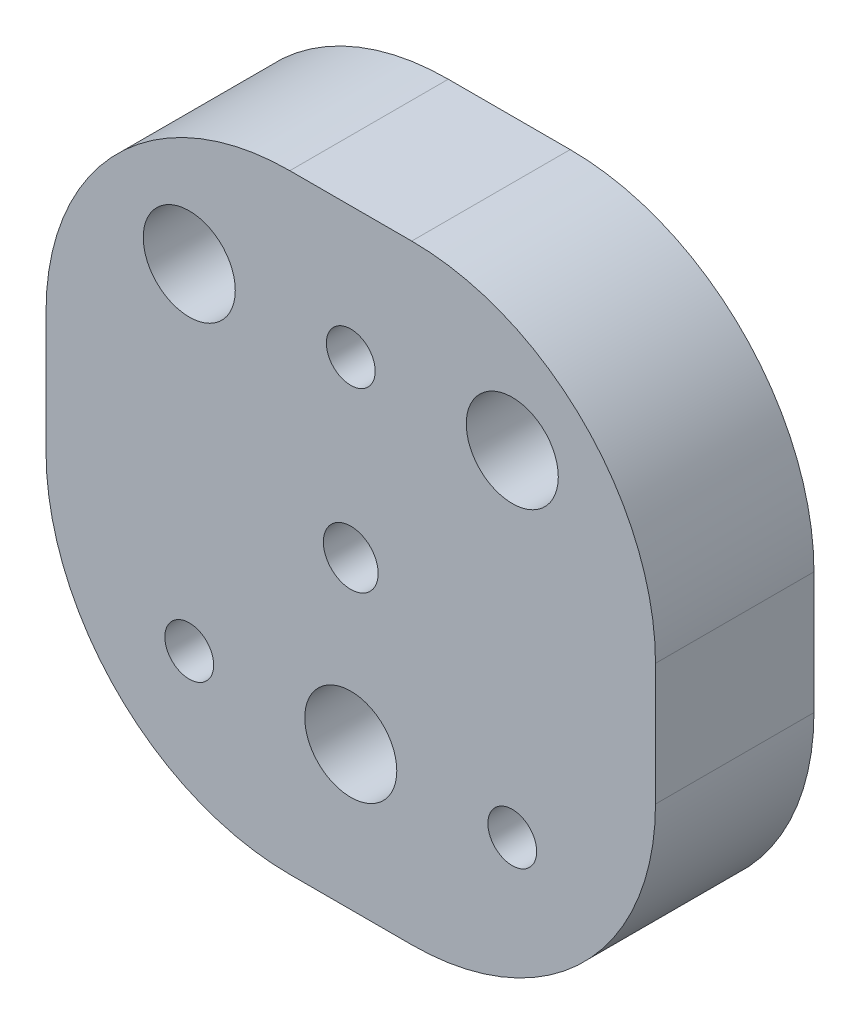
ISO-10303-21;
HEADER;
FILE_DESCRIPTION(('STEP AP214'),'2;1');
FILE_NAME('part.step','',(''),(''),'','','');
FILE_SCHEMA(('AUTOMOTIVE_DESIGN { 1 0 10303 214 1 1 1 1 }'));
ENDSEC;
DATA;
#1=APPLICATION_CONTEXT('core data for automotive mechanical design processes');
#2=APPLICATION_PROTOCOL_DEFINITION('international standard','automotive_design',2000,#1);
#3=PRODUCT_CONTEXT('',#1,'mechanical');
#4=PRODUCT('Part','Part','',(#3));
#5=PRODUCT_RELATED_PRODUCT_CATEGORY('part','',(#4));
#6=PRODUCT_DEFINITION_FORMATION('','',#4);
#7=PRODUCT_DEFINITION_CONTEXT('part definition',#1,'design');
#8=PRODUCT_DEFINITION('design','',#6,#7);
#9=PRODUCT_DEFINITION_SHAPE('','',#8);
#10=(LENGTH_UNIT() NAMED_UNIT(*) SI_UNIT(.MILLI.,.METRE.));
#11=(NAMED_UNIT(*) PLANE_ANGLE_UNIT() SI_UNIT($,.RADIAN.));
#12=(NAMED_UNIT(*) SI_UNIT($,.STERADIAN.) SOLID_ANGLE_UNIT());
#13=UNCERTAINTY_MEASURE_WITH_UNIT(LENGTH_MEASURE(1.E-05),#10,'distance_accuracy_value','');
#14=(GEOMETRIC_REPRESENTATION_CONTEXT(3) GLOBAL_UNCERTAINTY_ASSIGNED_CONTEXT((#13)) GLOBAL_UNIT_ASSIGNED_CONTEXT((#10,
#11,#12)) REPRESENTATION_CONTEXT('',''));
#15=CARTESIAN_POINT('',(0.,0.,0.));
#16=DIRECTION('',(0.,0.,1.));
#17=DIRECTION('',(1.,0.,0.));
#18=AXIS2_PLACEMENT_3D('',#15,#16,#17);
#19=CARTESIAN_POINT('',(50.,-50.,26.));
#20=DIRECTION('',(-1.,0.,0.));
#21=DIRECTION('',(0.,0.,1.));
#22=AXIS2_PLACEMENT_3D('',#19,#20,#21);
#23=PLANE('',#22);
#24=DIRECTION('',(0.,1.,0.));
#25=VECTOR('',#24,1.);
#26=CARTESIAN_POINT('',(50.,-50.,0.));
#27=LINE('',#26,#25);
#28=CARTESIAN_POINT('',(50.,-10.,0.));
#29=VERTEX_POINT('',#28);
#30=CARTESIAN_POINT('',(50.,10.,0.));
#31=VERTEX_POINT('',#30);
#32=EDGE_CURVE('E128',#29,#31,#27,.T.);
#33=ORIENTED_EDGE('',*,*,#32,.T.);
#34=DIRECTION('',(0.,0.,-1.));
#35=VECTOR('',#34,1.);
#36=CARTESIAN_POINT('',(50.,10.,26.));
#37=LINE('',#36,#35);
#38=CARTESIAN_POINT('',(50.,10.,26.));
#39=VERTEX_POINT('',#38);
#40=EDGE_CURVE('E106',#31,#39,#37,.F.);
#41=ORIENTED_EDGE('',*,*,#40,.T.);
#42=DIRECTION('',(0.,1.,0.));
#43=VECTOR('',#42,1.);
#44=CARTESIAN_POINT('',(50.,-50.,26.));
#45=LINE('',#44,#43);
#46=CARTESIAN_POINT('',(50.,-10.,26.));
#47=VERTEX_POINT('',#46);
#48=EDGE_CURVE('E138',#47,#39,#45,.T.);
#49=ORIENTED_EDGE('',*,*,#48,.F.);
#50=DIRECTION('',(0.,0.,-1.));
#51=VECTOR('',#50,1.);
#52=CARTESIAN_POINT('',(50.,-10.,26.));
#53=LINE('',#52,#51);
#54=EDGE_CURVE('E111',#47,#29,#53,.T.);
#55=ORIENTED_EDGE('',*,*,#54,.T.);
#56=EDGE_LOOP('',(#33,#41,#49,#55));
#57=FACE_BOUND('',#56,.T.);
#58=ADVANCED_FACE('F35',(#57),#23,.F.);
#59=CARTESIAN_POINT('',(-50.,50.,26.));
#60=DIRECTION('',(0.,-1.,0.));
#61=DIRECTION('',(0.,0.,-1.));
#62=AXIS2_PLACEMENT_3D('',#59,#60,#61);
#63=PLANE('',#62);
#64=DIRECTION('',(-1.,0.,0.));
#65=VECTOR('',#64,1.);
#66=CARTESIAN_POINT('',(-50.,50.,26.));
#67=LINE('',#66,#65);
#68=CARTESIAN_POINT('',(10.,50.,26.));
#69=VERTEX_POINT('',#68);
#70=CARTESIAN_POINT('',(-10.,50.,26.));
#71=VERTEX_POINT('',#70);
#72=EDGE_CURVE('E121',#69,#71,#67,.T.);
#73=ORIENTED_EDGE('',*,*,#72,.F.);
#74=DIRECTION('',(0.,0.,-1.));
#75=VECTOR('',#74,1.);
#76=CARTESIAN_POINT('',(10.,50.,26.));
#77=LINE('',#76,#75);
#78=CARTESIAN_POINT('',(10.,50.,0.));
#79=VERTEX_POINT('',#78);
#80=EDGE_CURVE('E105',#69,#79,#77,.T.);
#81=ORIENTED_EDGE('',*,*,#80,.T.);
#82=DIRECTION('',(-1.,0.,0.));
#83=VECTOR('',#82,1.);
#84=CARTESIAN_POINT('',(-50.,50.,0.));
#85=LINE('',#84,#83);
#86=CARTESIAN_POINT('',(-10.,50.,0.));
#87=VERTEX_POINT('',#86);
#88=EDGE_CURVE('E118',#79,#87,#85,.T.);
#89=ORIENTED_EDGE('',*,*,#88,.T.);
#90=DIRECTION('',(0.,0.,-1.));
#91=VECTOR('',#90,1.);
#92=CARTESIAN_POINT('',(-10.,50.,26.));
#93=LINE('',#92,#91);
#94=EDGE_CURVE('E123',#87,#71,#93,.F.);
#95=ORIENTED_EDGE('',*,*,#94,.T.);
#96=EDGE_LOOP('',(#73,#81,#89,#95));
#97=FACE_BOUND('',#96,.T.);
#98=ADVANCED_FACE('F117',(#97),#63,.F.);
#99=CARTESIAN_POINT('',(-50.,-50.,26.));
#100=DIRECTION('',(1.,0.,0.));
#101=DIRECTION('',(0.,0.,-1.));
#102=AXIS2_PLACEMENT_3D('',#99,#100,#101);
#103=PLANE('',#102);
#104=DIRECTION('',(0.,-1.,0.));
#105=VECTOR('',#104,1.);
#106=CARTESIAN_POINT('',(-50.,-50.,26.));
#107=LINE('',#106,#105);
#108=CARTESIAN_POINT('',(-50.,10.,26.));
#109=VERTEX_POINT('',#108);
#110=CARTESIAN_POINT('',(-50.,-10.,26.));
#111=VERTEX_POINT('',#110);
#112=EDGE_CURVE('E175',#109,#111,#107,.T.);
#113=ORIENTED_EDGE('',*,*,#112,.F.);
#114=DIRECTION('',(0.,0.,-1.));
#115=VECTOR('',#114,1.);
#116=CARTESIAN_POINT('',(-50.,10.,26.));
#117=LINE('',#116,#115);
#118=CARTESIAN_POINT('',(-50.,10.,0.));
#119=VERTEX_POINT('',#118);
#120=EDGE_CURVE('E168',#109,#119,#117,.T.);
#121=ORIENTED_EDGE('',*,*,#120,.T.);
#122=DIRECTION('',(0.,-1.,0.));
#123=VECTOR('',#122,1.);
#124=CARTESIAN_POINT('',(-50.,-50.,0.));
#125=LINE('',#124,#123);
#126=CARTESIAN_POINT('',(-50.,-10.,0.));
#127=VERTEX_POINT('',#126);
#128=EDGE_CURVE('E127',#119,#127,#125,.T.);
#129=ORIENTED_EDGE('',*,*,#128,.T.);
#130=DIRECTION('',(0.,0.,-1.));
#131=VECTOR('',#130,1.);
#132=CARTESIAN_POINT('',(-50.,-10.,26.));
#133=LINE('',#132,#131);
#134=EDGE_CURVE('E166',#127,#111,#133,.F.);
#135=ORIENTED_EDGE('',*,*,#134,.T.);
#136=EDGE_LOOP('',(#113,#121,#129,#135));
#137=FACE_BOUND('',#136,.T.);
#138=ADVANCED_FACE('F173',(#137),#103,.F.);
#139=CARTESIAN_POINT('',(-50.,-50.,26.));
#140=DIRECTION('',(0.,1.,0.));
#141=DIRECTION('',(0.,0.,1.));
#142=AXIS2_PLACEMENT_3D('',#139,#140,#141);
#143=PLANE('',#142);
#144=DIRECTION('',(1.,0.,0.));
#145=VECTOR('',#144,1.);
#146=CARTESIAN_POINT('',(-50.,-50.,26.));
#147=LINE('',#146,#145);
#148=CARTESIAN_POINT('',(-10.,-50.,26.));
#149=VERTEX_POINT('',#148);
#150=CARTESIAN_POINT('',(10.,-50.,26.));
#151=VERTEX_POINT('',#150);
#152=EDGE_CURVE('E150',#149,#151,#147,.T.);
#153=ORIENTED_EDGE('',*,*,#152,.F.);
#154=DIRECTION('',(0.,0.,-1.));
#155=VECTOR('',#154,1.);
#156=CARTESIAN_POINT('',(-10.,-50.,26.));
#157=LINE('',#156,#155);
#158=CARTESIAN_POINT('',(-10.,-50.,0.));
#159=VERTEX_POINT('',#158);
#160=EDGE_CURVE('E12',#149,#159,#157,.T.);
#161=ORIENTED_EDGE('',*,*,#160,.T.);
#162=DIRECTION('',(1.,0.,0.));
#163=VECTOR('',#162,1.);
#164=CARTESIAN_POINT('',(-50.,-50.,0.));
#165=LINE('',#164,#163);
#166=CARTESIAN_POINT('',(10.,-50.,0.));
#167=VERTEX_POINT('',#166);
#168=EDGE_CURVE('E131',#159,#167,#165,.T.);
#169=ORIENTED_EDGE('',*,*,#168,.T.);
#170=DIRECTION('',(0.,0.,-1.));
#171=VECTOR('',#170,1.);
#172=CARTESIAN_POINT('',(10.,-50.,26.));
#173=LINE('',#172,#171);
#174=EDGE_CURVE('E43',#167,#151,#173,.F.);
#175=ORIENTED_EDGE('',*,*,#174,.T.);
#176=EDGE_LOOP('',(#153,#161,#169,#175));
#177=FACE_BOUND('',#176,.T.);
#178=ADVANCED_FACE('F182',(#177),#143,.F.);
#179=CARTESIAN_POINT('',(0.,0.,26.));
#180=DIRECTION('',(0.,0.,-1.));
#181=DIRECTION('',(-1.,0.,0.));
#182=AXIS2_PLACEMENT_3D('',#179,#180,#181);
#183=PLANE('',#182);
#184=CARTESIAN_POINT('',(-26.5,28.4999999977077,26.));
#185=DIRECTION('',(0.,0.,1.));
#186=DIRECTION('',(1.,0.,0.));
#187=AXIS2_PLACEMENT_3D('',#184,#185,#186);
#188=CIRCLE('',#187,7.55);
#189=CARTESIAN_POINT('',(-18.95,28.4999999977077,26.));
#190=VERTEX_POINT('',#189);
#191=EDGE_CURVE('E222',#190,#190,#188,.T.);
#192=ORIENTED_EDGE('',*,*,#191,.F.);
#193=EDGE_LOOP('',(#192));
#194=FACE_BOUND('',#193,.T.);
#195=CARTESIAN_POINT('',(26.5000000000001,28.4999999977077,26.));
#196=DIRECTION('',(0.,0.,1.));
#197=DIRECTION('',(1.,0.,0.));
#198=AXIS2_PLACEMENT_3D('',#195,#196,#197);
#199=CIRCLE('',#198,7.55);
#200=CARTESIAN_POINT('',(34.0500000000001,28.4999999977077,26.));
#201=VERTEX_POINT('',#200);
#202=EDGE_CURVE('E216',#201,#201,#199,.T.);
#203=ORIENTED_EDGE('',*,*,#202,.F.);
#204=EDGE_LOOP('',(#203));
#205=FACE_BOUND('',#204,.T.);
#206=CARTESIAN_POINT('',(0.,-26.5000000022923,26.));
#207=DIRECTION('',(0.,0.,1.));
#208=DIRECTION('',(1.,0.,0.));
#209=AXIS2_PLACEMENT_3D('',#206,#207,#208);
#210=CIRCLE('',#209,7.55);
#211=CARTESIAN_POINT('',(7.55000000000001,-26.5000000022923,26.));
#212=VERTEX_POINT('',#211);
#213=EDGE_CURVE('E149',#212,#212,#210,.T.);
#214=ORIENTED_EDGE('',*,*,#213,.F.);
#215=EDGE_LOOP('',(#214));
#216=FACE_BOUND('',#215,.T.);
#217=CARTESIAN_POINT('',(0.,28.4999999982931,26.));
#218=DIRECTION('',(0.,0.,1.));
#219=DIRECTION('',(1.,0.,0.));
#220=AXIS2_PLACEMENT_3D('',#217,#218,#219);
#221=CIRCLE('',#220,4.00500000016434);
#222=CARTESIAN_POINT('',(4.00500000016433,28.4999999982931,26.));
#223=VERTEX_POINT('',#222);
#224=EDGE_CURVE('E206',#223,#223,#221,.T.);
#225=ORIENTED_EDGE('',*,*,#224,.F.);
#226=EDGE_LOOP('',(#225));
#227=FACE_BOUND('',#226,.T.);
#228=CARTESIAN_POINT('',(-26.5,-26.5000000005634,26.));
#229=DIRECTION('',(0.,0.,1.));
#230=DIRECTION('',(1.,0.,0.));
#231=AXIS2_PLACEMENT_3D('',#228,#229,#230);
#232=CIRCLE('',#231,4.00500000016472);
#233=CARTESIAN_POINT('',(-22.4949999998353,-26.5000000005634,26.));
#234=VERTEX_POINT('',#233);
#235=EDGE_CURVE('E200',#234,#234,#232,.T.);
#236=ORIENTED_EDGE('',*,*,#235,.F.);
#237=EDGE_LOOP('',(#236));
#238=FACE_BOUND('',#237,.T.);
#239=CARTESIAN_POINT('',(26.5,-26.5000000005634,26.));
#240=DIRECTION('',(0.,0.,1.));
#241=DIRECTION('',(1.,0.,0.));
#242=AXIS2_PLACEMENT_3D('',#239,#240,#241);
#243=CIRCLE('',#242,4.00500000016472);
#244=CARTESIAN_POINT('',(30.5050000001647,-26.5000000005634,26.));
#245=VERTEX_POINT('',#244);
#246=EDGE_CURVE('E192',#245,#245,#243,.T.);
#247=ORIENTED_EDGE('',*,*,#246,.F.);
#248=EDGE_LOOP('',(#247));
#249=FACE_BOUND('',#248,.T.);
#250=CARTESIAN_POINT('',(0.,0.,26.));
#251=DIRECTION('',(0.,0.,1.));
#252=DIRECTION('',(1.,0.,0.));
#253=AXIS2_PLACEMENT_3D('',#250,#251,#252);
#254=CIRCLE('',#253,4.5);
#255=CARTESIAN_POINT('',(4.5,0.,26.));
#256=VERTEX_POINT('',#255);
#257=EDGE_CURVE('E193',#256,#256,#254,.T.);
#258=ORIENTED_EDGE('',*,*,#257,.F.);
#259=EDGE_LOOP('',(#258));
#260=FACE_BOUND('',#259,.T.);
#261=ORIENTED_EDGE('',*,*,#48,.T.);
#262=CARTESIAN_POINT('',(10.,10.,26.));
#263=DIRECTION('',(0.,0.,-1.));
#264=DIRECTION('',(-1.,0.,0.));
#265=AXIS2_PLACEMENT_3D('',#262,#263,#264);
#266=CIRCLE('',#265,40.);
#267=EDGE_CURVE('E164',#39,#69,#266,.F.);
#268=ORIENTED_EDGE('',*,*,#267,.T.);
#269=ORIENTED_EDGE('',*,*,#72,.T.);
#270=CARTESIAN_POINT('',(-10.,10.,26.));
#271=DIRECTION('',(0.,0.,-1.));
#272=DIRECTION('',(-1.,0.,0.));
#273=AXIS2_PLACEMENT_3D('',#270,#271,#272);
#274=CIRCLE('',#273,40.);
#275=EDGE_CURVE('E162',#71,#109,#274,.F.);
#276=ORIENTED_EDGE('',*,*,#275,.T.);
#277=ORIENTED_EDGE('',*,*,#112,.T.);
#278=CARTESIAN_POINT('',(-10.,-10.,26.));
#279=DIRECTION('',(0.,0.,-1.));
#280=DIRECTION('',(-1.,0.,0.));
#281=AXIS2_PLACEMENT_3D('',#278,#279,#280);
#282=CIRCLE('',#281,40.);
#283=EDGE_CURVE('E56',#111,#149,#282,.F.);
#284=ORIENTED_EDGE('',*,*,#283,.T.);
#285=ORIENTED_EDGE('',*,*,#152,.T.);
#286=CARTESIAN_POINT('',(10.,-10.,26.));
#287=DIRECTION('',(0.,0.,-1.));
#288=DIRECTION('',(-1.,0.,0.));
#289=AXIS2_PLACEMENT_3D('',#286,#287,#288);
#290=CIRCLE('',#289,40.);
#291=EDGE_CURVE('E159',#151,#47,#290,.F.);
#292=ORIENTED_EDGE('',*,*,#291,.T.);
#293=EDGE_LOOP('',(#261,#268,#269,#276,#277,#284,#285,#292));
#294=FACE_BOUND('',#293,.T.);
#295=ADVANCED_FACE('F285',(#194,#205,#216,#227,#238,#249,#260,#294),#183,.F.);
#296=CARTESIAN_POINT('',(0.,0.,0.));
#297=DIRECTION('',(0.,0.,-1.));
#298=DIRECTION('',(-1.,0.,0.));
#299=AXIS2_PLACEMENT_3D('',#296,#297,#298);
#300=PLANE('',#299);
#301=CARTESIAN_POINT('',(-26.5,28.4999999977077,0.));
#302=DIRECTION('',(0.,0.,1.));
#303=DIRECTION('',(1.,0.,0.));
#304=AXIS2_PLACEMENT_3D('',#301,#302,#303);
#305=CIRCLE('',#304,4.5);
#306=CARTESIAN_POINT('',(-22.,28.4999999977077,0.));
#307=VERTEX_POINT('',#306);
#308=EDGE_CURVE('E143',#307,#307,#305,.T.);
#309=ORIENTED_EDGE('',*,*,#308,.T.);
#310=EDGE_LOOP('',(#309));
#311=FACE_BOUND('',#310,.T.);
#312=CARTESIAN_POINT('',(26.5000000000001,28.4999999977077,0.));
#313=DIRECTION('',(0.,0.,1.));
#314=DIRECTION('',(1.,0.,0.));
#315=AXIS2_PLACEMENT_3D('',#312,#313,#314);
#316=CIRCLE('',#315,4.5);
#317=CARTESIAN_POINT('',(31.0000000000001,28.4999999977077,0.));
#318=VERTEX_POINT('',#317);
#319=EDGE_CURVE('E232',#318,#318,#316,.T.);
#320=ORIENTED_EDGE('',*,*,#319,.T.);
#321=EDGE_LOOP('',(#320));
#322=FACE_BOUND('',#321,.T.);
#323=CARTESIAN_POINT('',(0.,-26.5000000022933,0.));
#324=DIRECTION('',(0.,0.,1.));
#325=DIRECTION('',(1.,0.,0.));
#326=AXIS2_PLACEMENT_3D('',#323,#324,#325);
#327=CIRCLE('',#326,4.5);
#328=CARTESIAN_POINT('',(4.50000000000001,-26.5000000022933,0.));
#329=VERTEX_POINT('',#328);
#330=EDGE_CURVE('E229',#329,#329,#327,.T.);
#331=ORIENTED_EDGE('',*,*,#330,.T.);
#332=EDGE_LOOP('',(#331));
#333=FACE_BOUND('',#332,.T.);
#334=ORIENTED_EDGE('',*,*,#88,.F.);
#335=CARTESIAN_POINT('',(10.,10.,0.));
#336=DIRECTION('',(0.,0.,-1.));
#337=DIRECTION('',(-1.,0.,0.));
#338=AXIS2_PLACEMENT_3D('',#335,#336,#337);
#339=CIRCLE('',#338,40.);
#340=EDGE_CURVE('E101',#79,#31,#339,.T.);
#341=ORIENTED_EDGE('',*,*,#340,.T.);
#342=ORIENTED_EDGE('',*,*,#32,.F.);
#343=CARTESIAN_POINT('',(10.,-10.,0.));
#344=DIRECTION('',(0.,0.,-1.));
#345=DIRECTION('',(-1.,0.,0.));
#346=AXIS2_PLACEMENT_3D('',#343,#344,#345);
#347=CIRCLE('',#346,40.);
#348=EDGE_CURVE('E122',#29,#167,#347,.T.);
#349=ORIENTED_EDGE('',*,*,#348,.T.);
#350=ORIENTED_EDGE('',*,*,#168,.F.);
#351=CARTESIAN_POINT('',(-10.,-10.,0.));
#352=DIRECTION('',(0.,0.,-1.));
#353=DIRECTION('',(-1.,0.,0.));
#354=AXIS2_PLACEMENT_3D('',#351,#352,#353);
#355=CIRCLE('',#354,40.);
#356=EDGE_CURVE('E153',#159,#127,#355,.T.);
#357=ORIENTED_EDGE('',*,*,#356,.T.);
#358=ORIENTED_EDGE('',*,*,#128,.F.);
#359=CARTESIAN_POINT('',(-10.,10.,0.));
#360=DIRECTION('',(0.,0.,-1.));
#361=DIRECTION('',(-1.,0.,0.));
#362=AXIS2_PLACEMENT_3D('',#359,#360,#361);
#363=CIRCLE('',#362,40.);
#364=EDGE_CURVE('E112',#119,#87,#363,.T.);
#365=ORIENTED_EDGE('',*,*,#364,.T.);
#366=EDGE_LOOP('',(#334,#341,#342,#349,#350,#357,#358,#365));
#367=FACE_BOUND('',#366,.T.);
#368=ADVANCED_FACE('F125',(#311,#322,#333,#367),#300,.T.);
#369=CARTESIAN_POINT('',(0.,0.,3.));
#370=DIRECTION('',(0.,0.,-1.));
#371=DIRECTION('',(-1.,0.,0.));
#372=AXIS2_PLACEMENT_3D('',#369,#370,#371);
#373=PLANE('',#372);
#374=CARTESIAN_POINT('',(0.,0.,3.));
#375=DIRECTION('',(0.,0.,-1.));
#376=DIRECTION('',(-1.,0.,0.));
#377=AXIS2_PLACEMENT_3D('',#374,#375,#376);
#378=CIRCLE('',#377,4.5);
#379=CARTESIAN_POINT('',(-4.5,0.,3.));
#380=VERTEX_POINT('',#379);
#381=EDGE_CURVE('E189',#380,#380,#378,.F.);
#382=ORIENTED_EDGE('',*,*,#381,.T.);
#383=EDGE_LOOP('',(#382));
#384=FACE_BOUND('',#383,.T.);
#385=ADVANCED_FACE('F293',(#384),#373,.F.);
#386=CARTESIAN_POINT('',(0.,0.,-12.7279220613579));
#387=DIRECTION('',(0.,0.,1.));
#388=DIRECTION('',(1.,0.,0.));
#389=AXIS2_PLACEMENT_3D('',#386,#387,#388);
#390=CYLINDRICAL_SURFACE('',#389,4.5);
#391=ORIENTED_EDGE('',*,*,#257,.T.);
#392=EDGE_LOOP('',(#391));
#393=FACE_BOUND('',#392,.T.);
#394=ORIENTED_EDGE('',*,*,#381,.F.);
#395=EDGE_LOOP('',(#394));
#396=FACE_BOUND('',#395,.T.);
#397=ADVANCED_FACE('F329',(#393,#396),#390,.F.);
#398=CARTESIAN_POINT('',(0.,0.,3.));
#399=DIRECTION('',(0.,0.,-1.));
#400=DIRECTION('',(-1.,0.,0.));
#401=AXIS2_PLACEMENT_3D('',#398,#399,#400);
#402=PLANE('',#401);
#403=CARTESIAN_POINT('',(26.5,-26.5000000005634,3.));
#404=DIRECTION('',(0.,0.,-1.));
#405=DIRECTION('',(-1.,0.,0.));
#406=AXIS2_PLACEMENT_3D('',#403,#404,#405);
#407=CIRCLE('',#406,4.00500000016472);
#408=CARTESIAN_POINT('',(22.4949999998353,-26.5000000005634,3.));
#409=VERTEX_POINT('',#408);
#410=EDGE_CURVE('E197',#409,#409,#407,.F.);
#411=ORIENTED_EDGE('',*,*,#410,.T.);
#412=EDGE_LOOP('',(#411));
#413=FACE_BOUND('',#412,.T.);
#414=ADVANCED_FACE('F335',(#413),#402,.F.);
#415=CARTESIAN_POINT('',(26.5,-26.5000000005634,-12.7279220613579));
#416=DIRECTION('',(0.,0.,1.));
#417=DIRECTION('',(1.,0.,0.));
#418=AXIS2_PLACEMENT_3D('',#415,#416,#417);
#419=CYLINDRICAL_SURFACE('',#418,4.00500000016472);
#420=ORIENTED_EDGE('',*,*,#246,.T.);
#421=EDGE_LOOP('',(#420));
#422=FACE_BOUND('',#421,.T.);
#423=ORIENTED_EDGE('',*,*,#410,.F.);
#424=EDGE_LOOP('',(#423));
#425=FACE_BOUND('',#424,.T.);
#426=ADVANCED_FACE('F342',(#422,#425),#419,.F.);
#427=CARTESIAN_POINT('',(0.,0.,3.));
#428=DIRECTION('',(0.,0.,-1.));
#429=DIRECTION('',(-1.,0.,0.));
#430=AXIS2_PLACEMENT_3D('',#427,#428,#429);
#431=PLANE('',#430);
#432=CARTESIAN_POINT('',(-26.5,-26.5000000005634,3.));
#433=DIRECTION('',(0.,0.,-1.));
#434=DIRECTION('',(-1.,0.,0.));
#435=AXIS2_PLACEMENT_3D('',#432,#433,#434);
#436=CIRCLE('',#435,4.00500000016472);
#437=CARTESIAN_POINT('',(-30.5050000001647,-26.5000000005634,3.));
#438=VERTEX_POINT('',#437);
#439=EDGE_CURVE('E203',#438,#438,#436,.F.);
#440=ORIENTED_EDGE('',*,*,#439,.T.);
#441=EDGE_LOOP('',(#440));
#442=FACE_BOUND('',#441,.T.);
#443=ADVANCED_FACE('F350',(#442),#431,.F.);
#444=CARTESIAN_POINT('',(-26.5,-26.5000000005634,-12.7279220613579));
#445=DIRECTION('',(0.,0.,1.));
#446=DIRECTION('',(1.,0.,0.));
#447=AXIS2_PLACEMENT_3D('',#444,#445,#446);
#448=CYLINDRICAL_SURFACE('',#447,4.00500000016472);
#449=ORIENTED_EDGE('',*,*,#235,.T.);
#450=EDGE_LOOP('',(#449));
#451=FACE_BOUND('',#450,.T.);
#452=ORIENTED_EDGE('',*,*,#439,.F.);
#453=EDGE_LOOP('',(#452));
#454=FACE_BOUND('',#453,.T.);
#455=ADVANCED_FACE('F358',(#451,#454),#448,.F.);
#456=CARTESIAN_POINT('',(0.,0.,3.));
#457=DIRECTION('',(0.,0.,-1.));
#458=DIRECTION('',(-1.,0.,0.));
#459=AXIS2_PLACEMENT_3D('',#456,#457,#458);
#460=PLANE('',#459);
#461=CARTESIAN_POINT('',(0.,28.4999999982931,3.));
#462=DIRECTION('',(0.,0.,-1.));
#463=DIRECTION('',(-1.,0.,0.));
#464=AXIS2_PLACEMENT_3D('',#461,#462,#463);
#465=CIRCLE('',#464,4.00500000016434);
#466=CARTESIAN_POINT('',(-4.00500000016434,28.4999999982931,3.));
#467=VERTEX_POINT('',#466);
#468=EDGE_CURVE('E133',#467,#467,#465,.F.);
#469=ORIENTED_EDGE('',*,*,#468,.T.);
#470=EDGE_LOOP('',(#469));
#471=FACE_BOUND('',#470,.T.);
#472=ADVANCED_FACE('F366',(#471),#460,.F.);
#473=CARTESIAN_POINT('',(0.,28.4999999982931,-12.7279220613579));
#474=DIRECTION('',(0.,0.,1.));
#475=DIRECTION('',(1.,0.,0.));
#476=AXIS2_PLACEMENT_3D('',#473,#474,#475);
#477=CYLINDRICAL_SURFACE('',#476,4.00500000016434);
#478=ORIENTED_EDGE('',*,*,#224,.T.);
#479=EDGE_LOOP('',(#478));
#480=FACE_BOUND('',#479,.T.);
#481=ORIENTED_EDGE('',*,*,#468,.F.);
#482=EDGE_LOOP('',(#481));
#483=FACE_BOUND('',#482,.T.);
#484=ADVANCED_FACE('F374',(#480,#483),#477,.F.);
#485=CARTESIAN_POINT('',(0.,0.,2.));
#486=DIRECTION('',(0.,0.,-1.));
#487=DIRECTION('',(-1.,0.,0.));
#488=AXIS2_PLACEMENT_3D('',#485,#486,#487);
#489=PLANE('',#488);
#490=CARTESIAN_POINT('',(0.,-26.5000000022933,2.));
#491=DIRECTION('',(0.,0.,-1.));
#492=DIRECTION('',(-1.,0.,0.));
#493=AXIS2_PLACEMENT_3D('',#490,#491,#492);
#494=CIRCLE('',#493,4.5);
#495=CARTESIAN_POINT('',(4.50000000000001,-26.5000000022933,2.));
#496=VERTEX_POINT('',#495);
#497=EDGE_CURVE('E146',#496,#496,#494,.T.);
#498=ORIENTED_EDGE('',*,*,#497,.T.);
#499=EDGE_LOOP('',(#498));
#500=FACE_BOUND('',#499,.T.);
#501=CARTESIAN_POINT('',(0.,-26.5000000022923,2.));
#502=DIRECTION('',(0.,0.,-1.));
#503=DIRECTION('',(-1.,0.,0.));
#504=AXIS2_PLACEMENT_3D('',#501,#502,#503);
#505=CIRCLE('',#504,7.55);
#506=CARTESIAN_POINT('',(-7.54999999999999,-26.5000000022923,2.));
#507=VERTEX_POINT('',#506);
#508=EDGE_CURVE('E213',#507,#507,#505,.F.);
#509=ORIENTED_EDGE('',*,*,#508,.T.);
#510=EDGE_LOOP('',(#509));
#511=FACE_BOUND('',#510,.T.);
#512=ADVANCED_FACE('F382',(#500,#511),#489,.F.);
#513=CARTESIAN_POINT('',(0.,-26.5000000022923,-21.3546247918337));
#514=DIRECTION('',(0.,0.,1.));
#515=DIRECTION('',(1.,0.,0.));
#516=AXIS2_PLACEMENT_3D('',#513,#514,#515);
#517=CYLINDRICAL_SURFACE('',#516,7.55);
#518=ORIENTED_EDGE('',*,*,#213,.T.);
#519=EDGE_LOOP('',(#518));
#520=FACE_BOUND('',#519,.T.);
#521=ORIENTED_EDGE('',*,*,#508,.F.);
#522=EDGE_LOOP('',(#521));
#523=FACE_BOUND('',#522,.T.);
#524=ADVANCED_FACE('F391',(#520,#523),#517,.F.);
#525=CARTESIAN_POINT('',(0.,0.,2.));
#526=DIRECTION('',(0.,0.,-1.));
#527=DIRECTION('',(-1.,0.,0.));
#528=AXIS2_PLACEMENT_3D('',#525,#526,#527);
#529=PLANE('',#528);
#530=CARTESIAN_POINT('',(26.5000000000001,28.4999999977077,2.));
#531=DIRECTION('',(0.,0.,-1.));
#532=DIRECTION('',(-1.,0.,0.));
#533=AXIS2_PLACEMENT_3D('',#530,#531,#532);
#534=CIRCLE('',#533,4.5);
#535=CARTESIAN_POINT('',(31.0000000000001,28.4999999977077,2.));
#536=VERTEX_POINT('',#535);
#537=EDGE_CURVE('E142',#536,#536,#534,.T.);
#538=ORIENTED_EDGE('',*,*,#537,.T.);
#539=EDGE_LOOP('',(#538));
#540=FACE_BOUND('',#539,.T.);
#541=CARTESIAN_POINT('',(26.5000000000001,28.4999999977077,2.));
#542=DIRECTION('',(0.,0.,-1.));
#543=DIRECTION('',(-1.,0.,0.));
#544=AXIS2_PLACEMENT_3D('',#541,#542,#543);
#545=CIRCLE('',#544,7.55);
#546=CARTESIAN_POINT('',(18.9500000000001,28.4999999977077,2.));
#547=VERTEX_POINT('',#546);
#548=EDGE_CURVE('E219',#547,#547,#545,.F.);
#549=ORIENTED_EDGE('',*,*,#548,.T.);
#550=EDGE_LOOP('',(#549));
#551=FACE_BOUND('',#550,.T.);
#552=ADVANCED_FACE('F399',(#540,#551),#529,.F.);
#553=CARTESIAN_POINT('',(26.5000000000001,28.4999999977077,-21.3546247918337));
#554=DIRECTION('',(0.,0.,1.));
#555=DIRECTION('',(1.,0.,0.));
#556=AXIS2_PLACEMENT_3D('',#553,#554,#555);
#557=CYLINDRICAL_SURFACE('',#556,7.55);
#558=ORIENTED_EDGE('',*,*,#202,.T.);
#559=EDGE_LOOP('',(#558));
#560=FACE_BOUND('',#559,.T.);
#561=ORIENTED_EDGE('',*,*,#548,.F.);
#562=EDGE_LOOP('',(#561));
#563=FACE_BOUND('',#562,.T.);
#564=ADVANCED_FACE('F251',(#560,#563),#557,.F.);
#565=CARTESIAN_POINT('',(0.,0.,2.));
#566=DIRECTION('',(0.,0.,-1.));
#567=DIRECTION('',(-1.,0.,0.));
#568=AXIS2_PLACEMENT_3D('',#565,#566,#567);
#569=PLANE('',#568);
#570=CARTESIAN_POINT('',(-26.5,28.4999999977077,2.));
#571=DIRECTION('',(0.,0.,-1.));
#572=DIRECTION('',(-1.,0.,0.));
#573=AXIS2_PLACEMENT_3D('',#570,#571,#572);
#574=CIRCLE('',#573,4.5);
#575=CARTESIAN_POINT('',(-22.,28.4999999977077,2.));
#576=VERTEX_POINT('',#575);
#577=EDGE_CURVE('E139',#576,#576,#574,.T.);
#578=ORIENTED_EDGE('',*,*,#577,.T.);
#579=EDGE_LOOP('',(#578));
#580=FACE_BOUND('',#579,.T.);
#581=CARTESIAN_POINT('',(-26.5,28.4999999977077,2.));
#582=DIRECTION('',(0.,0.,-1.));
#583=DIRECTION('',(-1.,0.,0.));
#584=AXIS2_PLACEMENT_3D('',#581,#582,#583);
#585=CIRCLE('',#584,7.55);
#586=CARTESIAN_POINT('',(-34.05,28.4999999977077,2.));
#587=VERTEX_POINT('',#586);
#588=EDGE_CURVE('E196',#587,#587,#585,.F.);
#589=ORIENTED_EDGE('',*,*,#588,.T.);
#590=EDGE_LOOP('',(#589));
#591=FACE_BOUND('',#590,.T.);
#592=ADVANCED_FACE('F248',(#580,#591),#569,.F.);
#593=CARTESIAN_POINT('',(-26.5,28.4999999977077,-21.3546247918337));
#594=DIRECTION('',(0.,0.,1.));
#595=DIRECTION('',(1.,0.,0.));
#596=AXIS2_PLACEMENT_3D('',#593,#594,#595);
#597=CYLINDRICAL_SURFACE('',#596,7.55);
#598=ORIENTED_EDGE('',*,*,#191,.T.);
#599=EDGE_LOOP('',(#598));
#600=FACE_BOUND('',#599,.T.);
#601=ORIENTED_EDGE('',*,*,#588,.F.);
#602=EDGE_LOOP('',(#601));
#603=FACE_BOUND('',#602,.T.);
#604=ADVANCED_FACE('F244',(#600,#603),#597,.F.);
#605=CARTESIAN_POINT('',(-26.5,28.4999999977077,0.));
#606=DIRECTION('',(0.,0.,1.));
#607=DIRECTION('',(1.,0.,0.));
#608=AXIS2_PLACEMENT_3D('',#605,#606,#607);
#609=CYLINDRICAL_SURFACE('',#608,4.5);
#610=CARTESIAN_POINT('',(-22.,28.4999999977077,0.));
#611=CARTESIAN_POINT('',(-22.,28.4999999977077,0.0208333333333333));
#612=CARTESIAN_POINT('',(-22.,28.4999999977077,0.0416666666666667));
#613=CARTESIAN_POINT('',(-22.,28.4999999977077,0.0833333333333334));
#614=CARTESIAN_POINT('',(-22.,28.4999999977077,0.104166666666667));
#615=CARTESIAN_POINT('',(-22.,28.4999999977077,0.145833333333333));
#616=CARTESIAN_POINT('',(-22.,28.4999999977077,0.166666666666667));
#617=CARTESIAN_POINT('',(-22.,28.4999999977077,0.208333333333333));
#618=CARTESIAN_POINT('',(-22.,28.4999999977077,0.229166666666667));
#619=CARTESIAN_POINT('',(-22.,28.4999999977077,0.270833333333333));
#620=CARTESIAN_POINT('',(-22.,28.4999999977077,0.291666666666667));
#621=CARTESIAN_POINT('',(-22.,28.4999999977077,0.333333333333333));
#622=CARTESIAN_POINT('',(-22.,28.4999999977077,0.354166666666667));
#623=CARTESIAN_POINT('',(-22.,28.4999999977077,0.395833333333333));
#624=CARTESIAN_POINT('',(-22.,28.4999999977077,0.416666666666667));
#625=CARTESIAN_POINT('',(-22.,28.4999999977077,0.458333333333333));
#626=CARTESIAN_POINT('',(-22.,28.4999999977077,0.479166666666667));
#627=CARTESIAN_POINT('',(-22.,28.4999999977077,0.520833333333333));
#628=CARTESIAN_POINT('',(-22.,28.4999999977077,0.541666666666667));
#629=CARTESIAN_POINT('',(-22.,28.4999999977077,0.583333333333333));
#630=CARTESIAN_POINT('',(-22.,28.4999999977077,0.604166666666667));
#631=CARTESIAN_POINT('',(-22.,28.4999999977077,0.645833333333334));
#632=CARTESIAN_POINT('',(-22.,28.4999999977077,0.666666666666667));
#633=CARTESIAN_POINT('',(-22.,28.4999999977077,0.708333333333333));
#634=CARTESIAN_POINT('',(-22.,28.4999999977077,0.729166666666667));
#635=CARTESIAN_POINT('',(-22.,28.4999999977077,0.770833333333334));
#636=CARTESIAN_POINT('',(-22.,28.4999999977077,0.791666666666667));
#637=CARTESIAN_POINT('',(-22.,28.4999999977077,0.833333333333334));
#638=CARTESIAN_POINT('',(-22.,28.4999999977077,0.854166666666667));
#639=CARTESIAN_POINT('',(-22.,28.4999999977077,0.895833333333334));
#640=CARTESIAN_POINT('',(-22.,28.4999999977077,0.916666666666667));
#641=CARTESIAN_POINT('',(-22.,28.4999999977077,0.958333333333334));
#642=CARTESIAN_POINT('',(-22.,28.4999999977077,0.979166666666667));
#643=CARTESIAN_POINT('',(-22.,28.4999999977077,1.02083333333333));
#644=CARTESIAN_POINT('',(-22.,28.4999999977077,1.04166666666667));
#645=CARTESIAN_POINT('',(-22.,28.4999999977077,1.08333333333333));
#646=CARTESIAN_POINT('',(-22.,28.4999999977077,1.10416666666667));
#647=CARTESIAN_POINT('',(-22.,28.4999999977077,1.14583333333333));
#648=CARTESIAN_POINT('',(-22.,28.4999999977077,1.16666666666667));
#649=CARTESIAN_POINT('',(-22.,28.4999999977077,1.20833333333333));
#650=CARTESIAN_POINT('',(-22.,28.4999999977077,1.22916666666667));
#651=CARTESIAN_POINT('',(-22.,28.4999999977077,1.27083333333333));
#652=CARTESIAN_POINT('',(-22.,28.4999999977077,1.29166666666667));
#653=CARTESIAN_POINT('',(-22.,28.4999999977077,1.33333333333333));
#654=CARTESIAN_POINT('',(-22.,28.4999999977077,1.35416666666667));
#655=CARTESIAN_POINT('',(-22.,28.4999999977077,1.39583333333333));
#656=CARTESIAN_POINT('',(-22.,28.4999999977077,1.41666666666667));
#657=CARTESIAN_POINT('',(-22.,28.4999999977077,1.45833333333333));
#658=CARTESIAN_POINT('',(-22.,28.4999999977077,1.47916666666667));
#659=CARTESIAN_POINT('',(-22.,28.4999999977077,1.52083333333333));
#660=CARTESIAN_POINT('',(-22.,28.4999999977077,1.54166666666667));
#661=CARTESIAN_POINT('',(-22.,28.4999999977077,1.58333333333333));
#662=CARTESIAN_POINT('',(-22.,28.4999999977077,1.60416666666667));
#663=CARTESIAN_POINT('',(-22.,28.4999999977077,1.64583333333333));
#664=CARTESIAN_POINT('',(-22.,28.4999999977077,1.66666666666667));
#665=CARTESIAN_POINT('',(-22.,28.4999999977077,1.70833333333333));
#666=CARTESIAN_POINT('',(-22.,28.4999999977077,1.72916666666667));
#667=CARTESIAN_POINT('',(-22.,28.4999999977077,1.77083333333333));
#668=CARTESIAN_POINT('',(-22.,28.4999999977077,1.79166666666667));
#669=CARTESIAN_POINT('',(-22.,28.4999999977077,1.83333333333333));
#670=CARTESIAN_POINT('',(-22.,28.4999999977077,1.85416666666667));
#671=CARTESIAN_POINT('',(-22.,28.4999999977077,1.89583333333333));
#672=CARTESIAN_POINT('',(-22.,28.4999999977077,1.91666666666667));
#673=CARTESIAN_POINT('',(-22.,28.4999999977077,1.95833333333333));
#674=CARTESIAN_POINT('',(-22.,28.4999999977077,1.97916666666667));
#675=CARTESIAN_POINT('',(-22.,28.4999999977077,2.));
#676=B_SPLINE_CURVE_WITH_KNOTS('',3,(#610,#611,#612,#613,#614,#615,#616,#617,#618,#619,#620,
#621,#622,#623,#624,#625,#626,#627,#628,#629,#630,#631,#632,#633,#634,#635,#636,#637,#638,#639,
#640,#641,#642,#643,#644,#645,#646,#647,#648,#649,#650,#651,#652,#653,#654,#655,#656,#657,#658,
#659,#660,#661,#662,#663,#664,#665,#666,#667,#668,#669,#670,#671,#672,#673,#674,#675),
.UNSPECIFIED.,.F.,.F.,(4,2,2,2,2,2,2,2,2,2,2,2,2,2,2,2,2,2,2,2,2,2,2,2,2,2,2,2,2,2,2,2,4),(0.,
0.0625,0.125,0.1875,0.25,0.3125,0.375,0.4375,0.5,0.5625,0.625,0.6875,0.75,0.8125,0.875,0.9375,
1.,1.0625,1.125,1.1875,1.25,1.3125,1.375,1.4375,1.5,1.5625,1.625,1.6875,1.75,1.8125,1.875,
1.9375,2.),.UNSPECIFIED.);
#677=EDGE_CURVE('BSEAM240',#307,#576,#676,.T.);
#678=ORIENTED_EDGE('',*,*,#308,.F.);
#679=ORIENTED_EDGE('',*,*,#577,.F.);
#680=ORIENTED_EDGE('',*,*,#677,.T.);
#681=ORIENTED_EDGE('',*,*,#677,.F.);
#682=EDGE_LOOP('',(#678,#680,#679,#681));
#683=FACE_BOUND('',#682,.T.);
#684=ADVANCED_FACE('F240',(#683),#609,.F.);
#685=CARTESIAN_POINT('',(26.5000000000001,28.4999999977077,0.));
#686=DIRECTION('',(0.,0.,1.));
#687=DIRECTION('',(1.,0.,0.));
#688=AXIS2_PLACEMENT_3D('',#685,#686,#687);
#689=CYLINDRICAL_SURFACE('',#688,4.5);
#690=CARTESIAN_POINT('',(31.0000000000001,28.4999999977077,0.));
#691=CARTESIAN_POINT('',(31.0000000000001,28.4999999977077,0.0208333333333333));
#692=CARTESIAN_POINT('',(31.0000000000001,28.4999999977077,0.0416666666666667));
#693=CARTESIAN_POINT('',(31.0000000000001,28.4999999977077,0.0833333333333334));
#694=CARTESIAN_POINT('',(31.0000000000001,28.4999999977077,0.104166666666667));
#695=CARTESIAN_POINT('',(31.0000000000001,28.4999999977077,0.145833333333333));
#696=CARTESIAN_POINT('',(31.0000000000001,28.4999999977077,0.166666666666667));
#697=CARTESIAN_POINT('',(31.0000000000001,28.4999999977077,0.208333333333333));
#698=CARTESIAN_POINT('',(31.0000000000001,28.4999999977077,0.229166666666667));
#699=CARTESIAN_POINT('',(31.0000000000001,28.4999999977077,0.270833333333333));
#700=CARTESIAN_POINT('',(31.0000000000001,28.4999999977077,0.291666666666667));
#701=CARTESIAN_POINT('',(31.0000000000001,28.4999999977077,0.333333333333333));
#702=CARTESIAN_POINT('',(31.0000000000001,28.4999999977077,0.354166666666667));
#703=CARTESIAN_POINT('',(31.0000000000001,28.4999999977077,0.395833333333333));
#704=CARTESIAN_POINT('',(31.0000000000001,28.4999999977077,0.416666666666667));
#705=CARTESIAN_POINT('',(31.0000000000001,28.4999999977077,0.458333333333333));
#706=CARTESIAN_POINT('',(31.0000000000001,28.4999999977077,0.479166666666667));
#707=CARTESIAN_POINT('',(31.0000000000001,28.4999999977077,0.520833333333333));
#708=CARTESIAN_POINT('',(31.0000000000001,28.4999999977077,0.541666666666667));
#709=CARTESIAN_POINT('',(31.0000000000001,28.4999999977077,0.583333333333333));
#710=CARTESIAN_POINT('',(31.0000000000001,28.4999999977077,0.604166666666667));
#711=CARTESIAN_POINT('',(31.0000000000001,28.4999999977077,0.645833333333334));
#712=CARTESIAN_POINT('',(31.0000000000001,28.4999999977077,0.666666666666667));
#713=CARTESIAN_POINT('',(31.0000000000001,28.4999999977077,0.708333333333333));
#714=CARTESIAN_POINT('',(31.0000000000001,28.4999999977077,0.729166666666667));
#715=CARTESIAN_POINT('',(31.0000000000001,28.4999999977077,0.770833333333334));
#716=CARTESIAN_POINT('',(31.0000000000001,28.4999999977077,0.791666666666667));
#717=CARTESIAN_POINT('',(31.0000000000001,28.4999999977077,0.833333333333334));
#718=CARTESIAN_POINT('',(31.0000000000001,28.4999999977077,0.854166666666667));
#719=CARTESIAN_POINT('',(31.0000000000001,28.4999999977077,0.895833333333334));
#720=CARTESIAN_POINT('',(31.0000000000001,28.4999999977077,0.916666666666667));
#721=CARTESIAN_POINT('',(31.0000000000001,28.4999999977077,0.958333333333334));
#722=CARTESIAN_POINT('',(31.0000000000001,28.4999999977077,0.979166666666667));
#723=CARTESIAN_POINT('',(31.0000000000001,28.4999999977077,1.02083333333333));
#724=CARTESIAN_POINT('',(31.0000000000001,28.4999999977077,1.04166666666667));
#725=CARTESIAN_POINT('',(31.0000000000001,28.4999999977077,1.08333333333333));
#726=CARTESIAN_POINT('',(31.0000000000001,28.4999999977077,1.10416666666667));
#727=CARTESIAN_POINT('',(31.0000000000001,28.4999999977077,1.14583333333333));
#728=CARTESIAN_POINT('',(31.0000000000001,28.4999999977077,1.16666666666667));
#729=CARTESIAN_POINT('',(31.0000000000001,28.4999999977077,1.20833333333333));
#730=CARTESIAN_POINT('',(31.0000000000001,28.4999999977077,1.22916666666667));
#731=CARTESIAN_POINT('',(31.0000000000001,28.4999999977077,1.27083333333333));
#732=CARTESIAN_POINT('',(31.0000000000001,28.4999999977077,1.29166666666667));
#733=CARTESIAN_POINT('',(31.0000000000001,28.4999999977077,1.33333333333333));
#734=CARTESIAN_POINT('',(31.0000000000001,28.4999999977077,1.35416666666667));
#735=CARTESIAN_POINT('',(31.0000000000001,28.4999999977077,1.39583333333333));
#736=CARTESIAN_POINT('',(31.0000000000001,28.4999999977077,1.41666666666667));
#737=CARTESIAN_POINT('',(31.0000000000001,28.4999999977077,1.45833333333333));
#738=CARTESIAN_POINT('',(31.0000000000001,28.4999999977077,1.47916666666667));
#739=CARTESIAN_POINT('',(31.0000000000001,28.4999999977077,1.52083333333333));
#740=CARTESIAN_POINT('',(31.0000000000001,28.4999999977077,1.54166666666667));
#741=CARTESIAN_POINT('',(31.0000000000001,28.4999999977077,1.58333333333333));
#742=CARTESIAN_POINT('',(31.0000000000001,28.4999999977077,1.60416666666667));
#743=CARTESIAN_POINT('',(31.0000000000001,28.4999999977077,1.64583333333333));
#744=CARTESIAN_POINT('',(31.0000000000001,28.4999999977077,1.66666666666667));
#745=CARTESIAN_POINT('',(31.0000000000001,28.4999999977077,1.70833333333333));
#746=CARTESIAN_POINT('',(31.0000000000001,28.4999999977077,1.72916666666667));
#747=CARTESIAN_POINT('',(31.0000000000001,28.4999999977077,1.77083333333333));
#748=CARTESIAN_POINT('',(31.0000000000001,28.4999999977077,1.79166666666667));
#749=CARTESIAN_POINT('',(31.0000000000001,28.4999999977077,1.83333333333333));
#750=CARTESIAN_POINT('',(31.0000000000001,28.4999999977077,1.85416666666667));
#751=CARTESIAN_POINT('',(31.0000000000001,28.4999999977077,1.89583333333333));
#752=CARTESIAN_POINT('',(31.0000000000001,28.4999999977077,1.91666666666667));
#753=CARTESIAN_POINT('',(31.0000000000001,28.4999999977077,1.95833333333333));
#754=CARTESIAN_POINT('',(31.0000000000001,28.4999999977077,1.97916666666667));
#755=CARTESIAN_POINT('',(31.0000000000001,28.4999999977077,2.));
#756=B_SPLINE_CURVE_WITH_KNOTS('',3,(#690,#691,#692,#693,#694,#695,#696,#697,#698,#699,#700,
#701,#702,#703,#704,#705,#706,#707,#708,#709,#710,#711,#712,#713,#714,#715,#716,#717,#718,#719,
#720,#721,#722,#723,#724,#725,#726,#727,#728,#729,#730,#731,#732,#733,#734,#735,#736,#737,#738,
#739,#740,#741,#742,#743,#744,#745,#746,#747,#748,#749,#750,#751,#752,#753,#754,#755),
.UNSPECIFIED.,.F.,.F.,(4,2,2,2,2,2,2,2,2,2,2,2,2,2,2,2,2,2,2,2,2,2,2,2,2,2,2,2,2,2,2,2,4),(0.,
0.0625,0.125,0.1875,0.25,0.3125,0.375,0.4375,0.5,0.5625,0.625,0.6875,0.75,0.8125,0.875,0.9375,
1.,1.0625,1.125,1.1875,1.25,1.3125,1.375,1.4375,1.5,1.5625,1.625,1.6875,1.75,1.8125,1.875,
1.9375,2.),.UNSPECIFIED.);
#757=EDGE_CURVE('BSEAM243',#318,#536,#756,.T.);
#758=ORIENTED_EDGE('',*,*,#319,.F.);
#759=ORIENTED_EDGE('',*,*,#537,.F.);
#760=ORIENTED_EDGE('',*,*,#757,.T.);
#761=ORIENTED_EDGE('',*,*,#757,.F.);
#762=EDGE_LOOP('',(#758,#760,#759,#761));
#763=FACE_BOUND('',#762,.T.);
#764=ADVANCED_FACE('F243',(#763),#689,.F.);
#765=CARTESIAN_POINT('',(0.,-26.5000000022933,0.));
#766=DIRECTION('',(0.,0.,1.));
#767=DIRECTION('',(1.,0.,0.));
#768=AXIS2_PLACEMENT_3D('',#765,#766,#767);
#769=CYLINDRICAL_SURFACE('',#768,4.5);
#770=CARTESIAN_POINT('',(4.50000000000001,-26.5000000022933,0.));
#771=CARTESIAN_POINT('',(4.50000000000001,-26.5000000022933,0.0208333333333333));
#772=CARTESIAN_POINT('',(4.50000000000001,-26.5000000022933,0.0416666666666667));
#773=CARTESIAN_POINT('',(4.50000000000001,-26.5000000022933,0.0833333333333334));
#774=CARTESIAN_POINT('',(4.50000000000001,-26.5000000022933,0.104166666666667));
#775=CARTESIAN_POINT('',(4.50000000000001,-26.5000000022933,0.145833333333333));
#776=CARTESIAN_POINT('',(4.50000000000001,-26.5000000022933,0.166666666666667));
#777=CARTESIAN_POINT('',(4.50000000000001,-26.5000000022933,0.208333333333333));
#778=CARTESIAN_POINT('',(4.50000000000001,-26.5000000022933,0.229166666666667));
#779=CARTESIAN_POINT('',(4.50000000000001,-26.5000000022933,0.270833333333333));
#780=CARTESIAN_POINT('',(4.50000000000001,-26.5000000022933,0.291666666666667));
#781=CARTESIAN_POINT('',(4.50000000000001,-26.5000000022933,0.333333333333333));
#782=CARTESIAN_POINT('',(4.50000000000001,-26.5000000022933,0.354166666666667));
#783=CARTESIAN_POINT('',(4.50000000000001,-26.5000000022933,0.395833333333333));
#784=CARTESIAN_POINT('',(4.50000000000001,-26.5000000022933,0.416666666666667));
#785=CARTESIAN_POINT('',(4.50000000000001,-26.5000000022933,0.458333333333333));
#786=CARTESIAN_POINT('',(4.50000000000001,-26.5000000022933,0.479166666666667));
#787=CARTESIAN_POINT('',(4.50000000000001,-26.5000000022933,0.520833333333333));
#788=CARTESIAN_POINT('',(4.50000000000001,-26.5000000022933,0.541666666666667));
#789=CARTESIAN_POINT('',(4.50000000000001,-26.5000000022933,0.583333333333333));
#790=CARTESIAN_POINT('',(4.50000000000001,-26.5000000022933,0.604166666666667));
#791=CARTESIAN_POINT('',(4.50000000000001,-26.5000000022933,0.645833333333334));
#792=CARTESIAN_POINT('',(4.50000000000001,-26.5000000022933,0.666666666666667));
#793=CARTESIAN_POINT('',(4.50000000000001,-26.5000000022933,0.708333333333333));
#794=CARTESIAN_POINT('',(4.50000000000001,-26.5000000022933,0.729166666666667));
#795=CARTESIAN_POINT('',(4.50000000000001,-26.5000000022933,0.770833333333334));
#796=CARTESIAN_POINT('',(4.50000000000001,-26.5000000022933,0.791666666666667));
#797=CARTESIAN_POINT('',(4.50000000000001,-26.5000000022933,0.833333333333334));
#798=CARTESIAN_POINT('',(4.50000000000001,-26.5000000022933,0.854166666666667));
#799=CARTESIAN_POINT('',(4.50000000000001,-26.5000000022933,0.895833333333334));
#800=CARTESIAN_POINT('',(4.50000000000001,-26.5000000022933,0.916666666666667));
#801=CARTESIAN_POINT('',(4.50000000000001,-26.5000000022933,0.958333333333334));
#802=CARTESIAN_POINT('',(4.50000000000001,-26.5000000022933,0.979166666666667));
#803=CARTESIAN_POINT('',(4.50000000000001,-26.5000000022933,1.02083333333333));
#804=CARTESIAN_POINT('',(4.50000000000001,-26.5000000022933,1.04166666666667));
#805=CARTESIAN_POINT('',(4.50000000000001,-26.5000000022933,1.08333333333333));
#806=CARTESIAN_POINT('',(4.50000000000001,-26.5000000022933,1.10416666666667));
#807=CARTESIAN_POINT('',(4.50000000000001,-26.5000000022933,1.14583333333333));
#808=CARTESIAN_POINT('',(4.50000000000001,-26.5000000022933,1.16666666666667));
#809=CARTESIAN_POINT('',(4.50000000000001,-26.5000000022933,1.20833333333333));
#810=CARTESIAN_POINT('',(4.50000000000001,-26.5000000022933,1.22916666666667));
#811=CARTESIAN_POINT('',(4.50000000000001,-26.5000000022933,1.27083333333333));
#812=CARTESIAN_POINT('',(4.50000000000001,-26.5000000022933,1.29166666666667));
#813=CARTESIAN_POINT('',(4.50000000000001,-26.5000000022933,1.33333333333333));
#814=CARTESIAN_POINT('',(4.50000000000001,-26.5000000022933,1.35416666666667));
#815=CARTESIAN_POINT('',(4.50000000000001,-26.5000000022933,1.39583333333333));
#816=CARTESIAN_POINT('',(4.50000000000001,-26.5000000022933,1.41666666666667));
#817=CARTESIAN_POINT('',(4.50000000000001,-26.5000000022933,1.45833333333333));
#818=CARTESIAN_POINT('',(4.50000000000001,-26.5000000022933,1.47916666666667));
#819=CARTESIAN_POINT('',(4.50000000000001,-26.5000000022933,1.52083333333333));
#820=CARTESIAN_POINT('',(4.50000000000001,-26.5000000022933,1.54166666666667));
#821=CARTESIAN_POINT('',(4.50000000000001,-26.5000000022933,1.58333333333333));
#822=CARTESIAN_POINT('',(4.50000000000001,-26.5000000022933,1.60416666666667));
#823=CARTESIAN_POINT('',(4.50000000000001,-26.5000000022933,1.64583333333333));
#824=CARTESIAN_POINT('',(4.50000000000001,-26.5000000022933,1.66666666666667));
#825=CARTESIAN_POINT('',(4.50000000000001,-26.5000000022933,1.70833333333333));
#826=CARTESIAN_POINT('',(4.50000000000001,-26.5000000022933,1.72916666666667));
#827=CARTESIAN_POINT('',(4.50000000000001,-26.5000000022933,1.77083333333333));
#828=CARTESIAN_POINT('',(4.50000000000001,-26.5000000022933,1.79166666666667));
#829=CARTESIAN_POINT('',(4.50000000000001,-26.5000000022933,1.83333333333333));
#830=CARTESIAN_POINT('',(4.50000000000001,-26.5000000022933,1.85416666666667));
#831=CARTESIAN_POINT('',(4.50000000000001,-26.5000000022933,1.89583333333333));
#832=CARTESIAN_POINT('',(4.50000000000001,-26.5000000022933,1.91666666666667));
#833=CARTESIAN_POINT('',(4.50000000000001,-26.5000000022933,1.95833333333333));
#834=CARTESIAN_POINT('',(4.50000000000001,-26.5000000022933,1.97916666666667));
#835=CARTESIAN_POINT('',(4.50000000000001,-26.5000000022933,2.));
#836=B_SPLINE_CURVE_WITH_KNOTS('',3,(#770,#771,#772,#773,#774,#775,#776,#777,#778,#779,#780,
#781,#782,#783,#784,#785,#786,#787,#788,#789,#790,#791,#792,#793,#794,#795,#796,#797,#798,#799,
#800,#801,#802,#803,#804,#805,#806,#807,#808,#809,#810,#811,#812,#813,#814,#815,#816,#817,#818,
#819,#820,#821,#822,#823,#824,#825,#826,#827,#828,#829,#830,#831,#832,#833,#834,#835),
.UNSPECIFIED.,.F.,.F.,(4,2,2,2,2,2,2,2,2,2,2,2,2,2,2,2,2,2,2,2,2,2,2,2,2,2,2,2,2,2,2,2,4),(0.,
0.0625,0.125,0.1875,0.25,0.3125,0.375,0.4375,0.5,0.5625,0.625,0.6875,0.75,0.8125,0.875,0.9375,
1.,1.0625,1.125,1.1875,1.25,1.3125,1.375,1.4375,1.5,1.5625,1.625,1.6875,1.75,1.8125,1.875,
1.9375,2.),.UNSPECIFIED.);
#837=EDGE_CURVE('BSEAM274',#329,#496,#836,.T.);
#838=ORIENTED_EDGE('',*,*,#330,.F.);
#839=ORIENTED_EDGE('',*,*,#497,.F.);
#840=ORIENTED_EDGE('',*,*,#837,.T.);
#841=ORIENTED_EDGE('',*,*,#837,.F.);
#842=EDGE_LOOP('',(#838,#840,#839,#841));
#843=FACE_BOUND('',#842,.T.);
#844=ADVANCED_FACE('F274',(#843),#769,.F.);
#845=CARTESIAN_POINT('',(10.,10.,26.));
#846=DIRECTION('',(0.,0.,-1.));
#847=DIRECTION('',(-1.,0.,0.));
#848=AXIS2_PLACEMENT_3D('',#845,#846,#847);
#849=CYLINDRICAL_SURFACE('',#848,40.);
#850=ORIENTED_EDGE('',*,*,#267,.F.);
#851=ORIENTED_EDGE('',*,*,#40,.F.);
#852=ORIENTED_EDGE('',*,*,#340,.F.);
#853=ORIENTED_EDGE('',*,*,#80,.F.);
#854=EDGE_LOOP('',(#850,#851,#852,#853));
#855=FACE_BOUND('',#854,.T.);
#856=ADVANCED_FACE('F104',(#855),#849,.T.);
#857=CARTESIAN_POINT('',(-10.,10.,26.));
#858=DIRECTION('',(0.,0.,-1.));
#859=DIRECTION('',(-1.,0.,0.));
#860=AXIS2_PLACEMENT_3D('',#857,#858,#859);
#861=CYLINDRICAL_SURFACE('',#860,40.);
#862=ORIENTED_EDGE('',*,*,#275,.F.);
#863=ORIENTED_EDGE('',*,*,#94,.F.);
#864=ORIENTED_EDGE('',*,*,#364,.F.);
#865=ORIENTED_EDGE('',*,*,#120,.F.);
#866=EDGE_LOOP('',(#862,#863,#864,#865));
#867=FACE_BOUND('',#866,.T.);
#868=ADVANCED_FACE('F273',(#867),#861,.T.);
#869=CARTESIAN_POINT('',(-10.,-10.,26.));
#870=DIRECTION('',(0.,0.,-1.));
#871=DIRECTION('',(-1.,0.,0.));
#872=AXIS2_PLACEMENT_3D('',#869,#870,#871);
#873=CYLINDRICAL_SURFACE('',#872,40.);
#874=ORIENTED_EDGE('',*,*,#283,.F.);
#875=ORIENTED_EDGE('',*,*,#134,.F.);
#876=ORIENTED_EDGE('',*,*,#356,.F.);
#877=ORIENTED_EDGE('',*,*,#160,.F.);
#878=EDGE_LOOP('',(#874,#875,#876,#877));
#879=FACE_BOUND('',#878,.T.);
#880=ADVANCED_FACE('F181',(#879),#873,.T.);
#881=CARTESIAN_POINT('',(10.,-10.,26.));
#882=DIRECTION('',(0.,0.,-1.));
#883=DIRECTION('',(-1.,0.,0.));
#884=AXIS2_PLACEMENT_3D('',#881,#882,#883);
#885=CYLINDRICAL_SURFACE('',#884,40.);
#886=ORIENTED_EDGE('',*,*,#291,.F.);
#887=ORIENTED_EDGE('',*,*,#174,.F.);
#888=ORIENTED_EDGE('',*,*,#348,.F.);
#889=ORIENTED_EDGE('',*,*,#54,.F.);
#890=EDGE_LOOP('',(#886,#887,#888,#889));
#891=FACE_BOUND('',#890,.T.);
#892=ADVANCED_FACE('F37',(#891),#885,.T.);
#893=CLOSED_SHELL('',(#58,#98,#138,#178,#295,#368,#385,#397,#414,#426,#443,#455,#472,#484,#512,
#524,#552,#564,#592,#604,#684,#764,#844,#856,#868,#880,#892));
#894=MANIFOLD_SOLID_BREP('B2',#893);
#895=ADVANCED_BREP_SHAPE_REPRESENTATION('',(#18,#894),#14);
#896=SHAPE_DEFINITION_REPRESENTATION(#9,#895);
ENDSEC;
END-ISO-10303-21;
